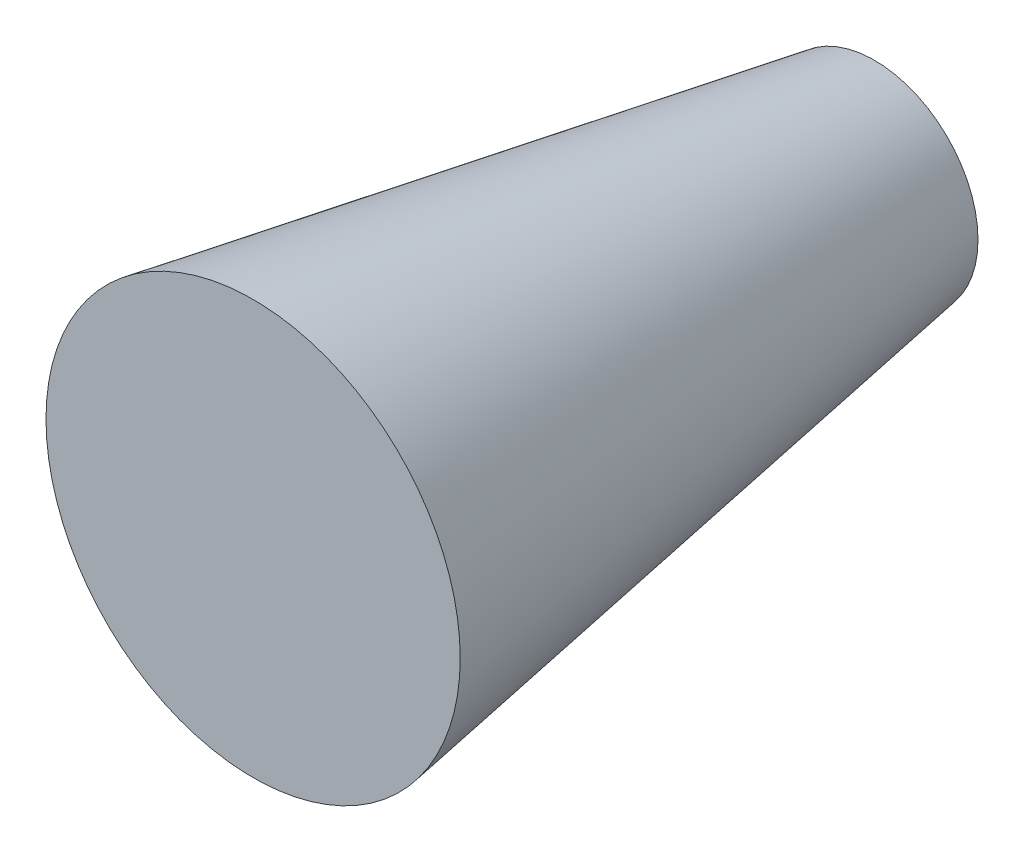
ISO-10303-21;
HEADER;
FILE_DESCRIPTION(('STEP AP214'),'2;1');
FILE_NAME('part.step','',(''),(''),'','','');
FILE_SCHEMA(('AUTOMOTIVE_DESIGN { 1 0 10303 214 1 1 1 1 }'));
ENDSEC;
DATA;
#1=APPLICATION_CONTEXT('core data for automotive mechanical design processes');
#2=APPLICATION_PROTOCOL_DEFINITION('international standard','automotive_design',2000,#1);
#3=PRODUCT_CONTEXT('',#1,'mechanical');
#4=PRODUCT('Part','Part','',(#3));
#5=PRODUCT_RELATED_PRODUCT_CATEGORY('part','',(#4));
#6=PRODUCT_DEFINITION_FORMATION('','',#4);
#7=PRODUCT_DEFINITION_CONTEXT('part definition',#1,'design');
#8=PRODUCT_DEFINITION('design','',#6,#7);
#9=PRODUCT_DEFINITION_SHAPE('','',#8);
#10=(LENGTH_UNIT() NAMED_UNIT(*) SI_UNIT(.MILLI.,.METRE.));
#11=(NAMED_UNIT(*) PLANE_ANGLE_UNIT() SI_UNIT($,.RADIAN.));
#12=(NAMED_UNIT(*) SI_UNIT($,.STERADIAN.) SOLID_ANGLE_UNIT());
#13=UNCERTAINTY_MEASURE_WITH_UNIT(LENGTH_MEASURE(1.E-05),#10,'distance_accuracy_value','');
#14=(GEOMETRIC_REPRESENTATION_CONTEXT(3) GLOBAL_UNCERTAINTY_ASSIGNED_CONTEXT((#13)) GLOBAL_UNIT_ASSIGNED_CONTEXT((#10,
#11,#12)) REPRESENTATION_CONTEXT('',''));
#15=CARTESIAN_POINT('',(0.,0.,0.));
#16=DIRECTION('',(0.,0.,1.));
#17=DIRECTION('',(1.,0.,0.));
#18=AXIS2_PLACEMENT_3D('',#15,#16,#17);
#19=CARTESIAN_POINT('',(0.,0.,30.));
#20=DIRECTION('',(0.,0.,1.));
#21=DIRECTION('',(1.,0.,0.));
#22=AXIS2_PLACEMENT_3D('',#19,#20,#21);
#23=PLANE('',#22);
#24=CARTESIAN_POINT('',(0.,0.,30.));
#25=DIRECTION('',(0.,0.,1.));
#26=DIRECTION('',(1.,0.,0.));
#27=AXIS2_PLACEMENT_3D('',#24,#25,#26);
#28=CIRCLE('',#27,10.);
#29=CARTESIAN_POINT('',(10.,0.,30.));
#30=VERTEX_POINT('',#29);
#31=EDGE_CURVE('E11',#30,#30,#28,.T.);
#32=ORIENTED_EDGE('',*,*,#31,.T.);
#33=EDGE_LOOP('',(#32));
#34=FACE_BOUND('',#33,.T.);
#35=ADVANCED_FACE('F44',(#34),#23,.T.);
#36=CARTESIAN_POINT('',(0.,0.,0.));
#37=DIRECTION('',(0.,0.,1.));
#38=DIRECTION('',(1.,0.,0.));
#39=AXIS2_PLACEMENT_3D('',#36,#37,#38);
#40=PLANE('',#39);
#41=CARTESIAN_POINT('',(0.,0.,0.));
#42=DIRECTION('',(0.,0.,1.));
#43=DIRECTION('',(1.,0.,0.));
#44=AXIS2_PLACEMENT_3D('',#41,#42,#43);
#45=CIRCLE('',#44,5.);
#46=CARTESIAN_POINT('',(5.,0.,0.));
#47=VERTEX_POINT('',#46);
#48=EDGE_CURVE('E52',#47,#47,#45,.T.);
#49=ORIENTED_EDGE('',*,*,#48,.F.);
#50=EDGE_LOOP('',(#49));
#51=FACE_BOUND('',#50,.T.);
#52=ADVANCED_FACE('F78',(#51),#40,.F.);
#53=CARTESIAN_POINT('',(0.,0.,0.));
#54=DIRECTION('',(0.,0.,1.));
#55=DIRECTION('',(1.,0.,0.));
#56=AXIS2_PLACEMENT_3D('',#53,#54,#55);
#57=CONICAL_SURFACE('',#56,5.,0.165148677414627);
#58=ORIENTED_EDGE('',*,*,#48,.T.);
#59=EDGE_LOOP('',(#58));
#60=FACE_BOUND('',#59,.T.);
#61=ORIENTED_EDGE('',*,*,#31,.F.);
#62=EDGE_LOOP('',(#61));
#63=FACE_BOUND('',#62,.T.);
#64=ADVANCED_FACE('F81',(#60,#63),#57,.T.);
#65=CLOSED_SHELL('',(#35,#52,#64));
#66=MANIFOLD_SOLID_BREP('B2',#65);
#67=ADVANCED_BREP_SHAPE_REPRESENTATION('',(#18,#66),#14);
#68=SHAPE_DEFINITION_REPRESENTATION(#9,#67);
ENDSEC;
END-ISO-10303-21;
